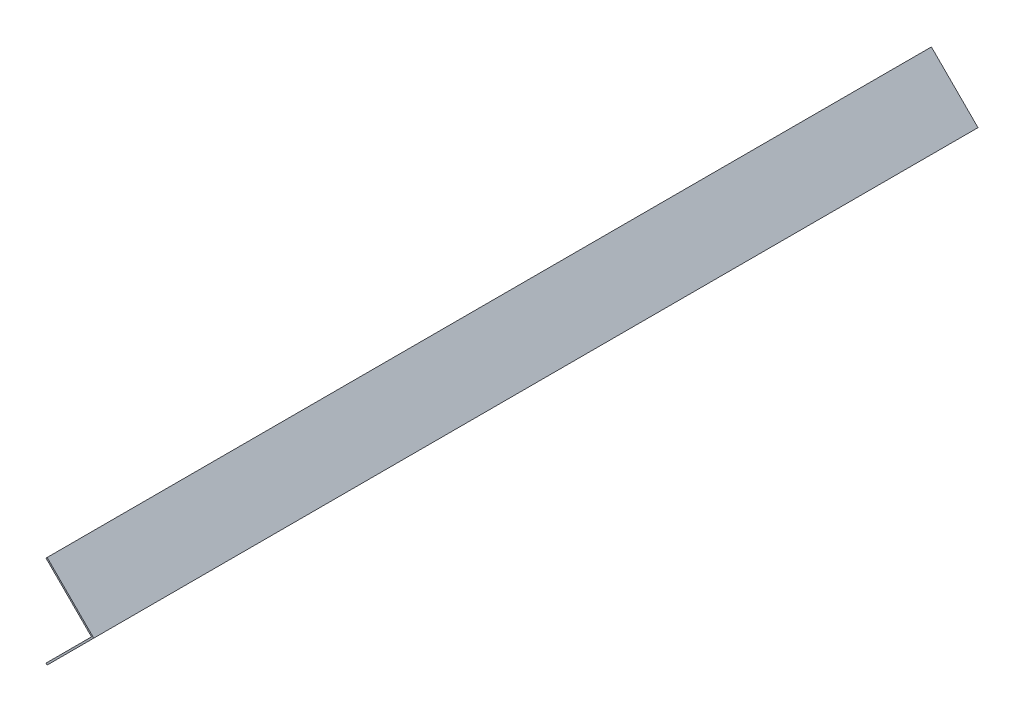
ISO-10303-21;
HEADER;
FILE_DESCRIPTION(('STEP AP214'),'2;1');
FILE_NAME('part.step','',(''),(''),'','','');
FILE_SCHEMA(('AUTOMOTIVE_DESIGN { 1 0 10303 214 1 1 1 1 }'));
ENDSEC;
DATA;
#1=APPLICATION_CONTEXT('core data for automotive mechanical design processes');
#2=APPLICATION_PROTOCOL_DEFINITION('international standard','automotive_design',2000,#1);
#3=PRODUCT_CONTEXT('',#1,'mechanical');
#4=PRODUCT('Part','Part','',(#3));
#5=PRODUCT_RELATED_PRODUCT_CATEGORY('part','',(#4));
#6=PRODUCT_DEFINITION_FORMATION('','',#4);
#7=PRODUCT_DEFINITION_CONTEXT('part definition',#1,'design');
#8=PRODUCT_DEFINITION('design','',#6,#7);
#9=PRODUCT_DEFINITION_SHAPE('','',#8);
#10=(LENGTH_UNIT() NAMED_UNIT(*) SI_UNIT(.MILLI.,.METRE.));
#11=(NAMED_UNIT(*) PLANE_ANGLE_UNIT() SI_UNIT($,.RADIAN.));
#12=(NAMED_UNIT(*) SI_UNIT($,.STERADIAN.) SOLID_ANGLE_UNIT());
#13=UNCERTAINTY_MEASURE_WITH_UNIT(LENGTH_MEASURE(1.E-05),#10,'distance_accuracy_value','');
#14=(GEOMETRIC_REPRESENTATION_CONTEXT(3) GLOBAL_UNCERTAINTY_ASSIGNED_CONTEXT((#13)) GLOBAL_UNIT_ASSIGNED_CONTEXT((#10,
#11,#12)) REPRESENTATION_CONTEXT('',''));
#15=CARTESIAN_POINT('',(0.,0.,0.));
#16=DIRECTION('',(0.,0.,1.));
#17=DIRECTION('',(1.,0.,0.));
#18=AXIS2_PLACEMENT_3D('',#15,#16,#17);
#19=CARTESIAN_POINT('',(0.,0.,275.));
#20=DIRECTION('',(0.707106781186548,-0.707106781186548,0.));
#21=DIRECTION('',(0.707106781186548,0.707106781186548,0.));
#22=AXIS2_PLACEMENT_3D('',#19,#20,#21);
#23=PLANE('',#22);
#24=DIRECTION('',(-0.707106781186548,-0.707106781186548,0.));
#25=VECTOR('',#24,1.);
#26=CARTESIAN_POINT('',(0.,0.,-275.));
#27=LINE('',#26,#25);
#28=CARTESIAN_POINT('',(0.,0.,-275.));
#29=VERTEX_POINT('',#28);
#30=CARTESIAN_POINT('',(-28.2842712474619,-28.2842712474619,-275.));
#31=VERTEX_POINT('',#30);
#32=EDGE_CURVE('E117',#29,#31,#27,.T.);
#33=ORIENTED_EDGE('',*,*,#32,.T.);
#34=DIRECTION('',(0.,0.,-1.));
#35=VECTOR('',#34,1.);
#36=CARTESIAN_POINT('',(-28.2842712474619,-28.2842712474619,275.));
#37=LINE('',#36,#35);
#38=CARTESIAN_POINT('',(-28.2842712474619,-28.2842712474619,275.));
#39=VERTEX_POINT('',#38);
#40=EDGE_CURVE('E11',#39,#31,#37,.T.);
#41=ORIENTED_EDGE('',*,*,#40,.F.);
#42=DIRECTION('',(-0.707106781186548,-0.707106781186548,0.));
#43=VECTOR('',#42,1.);
#44=CARTESIAN_POINT('',(0.,0.,275.));
#45=LINE('',#44,#43);
#46=CARTESIAN_POINT('',(0.,0.,275.));
#47=VERTEX_POINT('',#46);
#48=EDGE_CURVE('E127',#47,#39,#45,.T.);
#49=ORIENTED_EDGE('',*,*,#48,.F.);
#50=DIRECTION('',(0.,0.,-1.));
#51=VECTOR('',#50,1.);
#52=CARTESIAN_POINT('',(0.,0.,275.));
#53=LINE('',#52,#51);
#54=EDGE_CURVE('E113',#47,#29,#53,.T.);
#55=ORIENTED_EDGE('',*,*,#54,.T.);
#56=EDGE_LOOP('',(#33,#41,#49,#55));
#57=FACE_BOUND('',#56,.T.);
#58=ADVANCED_FACE('F33',(#57),#23,.F.);
#59=CARTESIAN_POINT('',(-27.5771644662754,-28.9913780286485,275.));
#60=DIRECTION('',(0.707106781186554,0.707106781186541,0.));
#61=DIRECTION('',(-0.707106781186541,0.707106781186554,0.));
#62=AXIS2_PLACEMENT_3D('',#59,#60,#61);
#63=PLANE('',#62);
#64=DIRECTION('',(0.707106781186541,-0.707106781186554,0.));
#65=VECTOR('',#64,1.);
#66=CARTESIAN_POINT('',(-27.5771644662754,-28.9913780286485,-275.));
#67=LINE('',#66,#65);
#68=CARTESIAN_POINT('',(-27.5771644662754,-28.9913780286485,-275.));
#69=VERTEX_POINT('',#68);
#70=EDGE_CURVE('E120',#31,#69,#67,.T.);
#71=ORIENTED_EDGE('',*,*,#70,.T.);
#72=DIRECTION('',(0.,0.,-1.));
#73=VECTOR('',#72,1.);
#74=CARTESIAN_POINT('',(-27.5771644662754,-28.9913780286485,275.));
#75=LINE('',#74,#73);
#76=CARTESIAN_POINT('',(-27.5771644662754,-28.9913780286485,275.));
#77=VERTEX_POINT('',#76);
#78=EDGE_CURVE('E41',#77,#69,#75,.T.);
#79=ORIENTED_EDGE('',*,*,#78,.F.);
#80=DIRECTION('',(0.707106781186541,-0.707106781186554,0.));
#81=VECTOR('',#80,1.);
#82=CARTESIAN_POINT('',(-27.5771644662754,-28.9913780286485,275.));
#83=LINE('',#82,#81);
#84=EDGE_CURVE('E86',#39,#77,#83,.T.);
#85=ORIENTED_EDGE('',*,*,#84,.F.);
#86=ORIENTED_EDGE('',*,*,#40,.T.);
#87=EDGE_LOOP('',(#71,#79,#85,#86));
#88=FACE_BOUND('',#87,.T.);
#89=ADVANCED_FACE('F151',(#88),#63,.F.);
#90=CARTESIAN_POINT('',(1.41421356237309,0.,275.));
#91=DIRECTION('',(-0.707106781186548,0.707106781186547,0.));
#92=DIRECTION('',(-0.707106781186547,-0.707106781186548,0.));
#93=AXIS2_PLACEMENT_3D('',#90,#91,#92);
#94=PLANE('',#93);
#95=DIRECTION('',(0.707106781186548,0.707106781186548,0.));
#96=VECTOR('',#95,1.);
#97=CARTESIAN_POINT('',(1.41421356237309,0.,-275.));
#98=LINE('',#97,#96);
#99=CARTESIAN_POINT('',(1.41421356237309,0.,-275.));
#100=VERTEX_POINT('',#99);
#101=EDGE_CURVE('E122',#69,#100,#98,.T.);
#102=ORIENTED_EDGE('',*,*,#101,.T.);
#103=DIRECTION('',(0.,0.,-1.));
#104=VECTOR('',#103,1.);
#105=CARTESIAN_POINT('',(1.41421356237309,0.,275.));
#106=LINE('',#105,#104);
#107=CARTESIAN_POINT('',(1.41421356237309,0.,275.));
#108=VERTEX_POINT('',#107);
#109=EDGE_CURVE('E108',#108,#100,#106,.T.);
#110=ORIENTED_EDGE('',*,*,#109,.F.);
#111=DIRECTION('',(0.707106781186548,0.707106781186548,0.));
#112=VECTOR('',#111,1.);
#113=CARTESIAN_POINT('',(1.41421356237309,0.,275.));
#114=LINE('',#113,#112);
#115=EDGE_CURVE('E99',#77,#108,#114,.T.);
#116=ORIENTED_EDGE('',*,*,#115,.F.);
#117=ORIENTED_EDGE('',*,*,#78,.T.);
#118=EDGE_LOOP('',(#102,#110,#116,#117));
#119=FACE_BOUND('',#118,.T.);
#120=ADVANCED_FACE('F133',(#119),#94,.F.);
#121=CARTESIAN_POINT('',(1.41421356237309,0.,275.));
#122=DIRECTION('',(-0.70710678118655,-0.707106781186545,0.));
#123=DIRECTION('',(0.707106781186545,-0.70710678118655,0.));
#124=AXIS2_PLACEMENT_3D('',#121,#122,#123);
#125=PLANE('',#124);
#126=DIRECTION('',(-0.707106781186545,0.70710678118655,0.));
#127=VECTOR('',#126,1.);
#128=CARTESIAN_POINT('',(1.41421356237309,0.,-275.));
#129=LINE('',#128,#127);
#130=CARTESIAN_POINT('',(-27.5771644662752,28.9913780286486,-275.));
#131=VERTEX_POINT('',#130);
#132=EDGE_CURVE('E107',#100,#131,#129,.T.);
#133=ORIENTED_EDGE('',*,*,#132,.T.);
#134=DIRECTION('',(0.,0.,-1.));
#135=VECTOR('',#134,1.);
#136=CARTESIAN_POINT('',(-27.5771644662752,28.9913780286486,275.));
#137=LINE('',#136,#135);
#138=CARTESIAN_POINT('',(-27.5771644662752,28.9913780286486,275.));
#139=VERTEX_POINT('',#138);
#140=EDGE_CURVE('E104',#139,#131,#137,.T.);
#141=ORIENTED_EDGE('',*,*,#140,.F.);
#142=DIRECTION('',(-0.707106781186545,0.70710678118655,0.));
#143=VECTOR('',#142,1.);
#144=CARTESIAN_POINT('',(1.41421356237309,0.,275.));
#145=LINE('',#144,#143);
#146=EDGE_CURVE('E93',#108,#139,#145,.T.);
#147=ORIENTED_EDGE('',*,*,#146,.F.);
#148=ORIENTED_EDGE('',*,*,#109,.T.);
#149=EDGE_LOOP('',(#133,#141,#147,#148));
#150=FACE_BOUND('',#149,.T.);
#151=ADVANCED_FACE('F105',(#150),#125,.F.);
#152=CARTESIAN_POINT('',(-28.2842712474618,28.284271247462,275.));
#153=DIRECTION('',(0.707106781186549,-0.707106781186546,0.));
#154=DIRECTION('',(0.707106781186546,0.707106781186549,0.));
#155=AXIS2_PLACEMENT_3D('',#152,#153,#154);
#156=PLANE('',#155);
#157=DIRECTION('',(-0.707106781186546,-0.707106781186549,0.));
#158=VECTOR('',#157,1.);
#159=CARTESIAN_POINT('',(-28.2842712474618,28.284271247462,-275.));
#160=LINE('',#159,#158);
#161=CARTESIAN_POINT('',(-28.2842712474618,28.284271247462,-275.));
#162=VERTEX_POINT('',#161);
#163=EDGE_CURVE('E72',#131,#162,#160,.T.);
#164=ORIENTED_EDGE('',*,*,#163,.T.);
#165=DIRECTION('',(0.,0.,-1.));
#166=VECTOR('',#165,1.);
#167=CARTESIAN_POINT('',(-28.2842712474618,28.284271247462,275.));
#168=LINE('',#167,#166);
#169=CARTESIAN_POINT('',(-28.2842712474618,28.284271247462,275.));
#170=VERTEX_POINT('',#169);
#171=EDGE_CURVE('E109',#170,#162,#168,.T.);
#172=ORIENTED_EDGE('',*,*,#171,.F.);
#173=DIRECTION('',(-0.707106781186546,-0.707106781186549,0.));
#174=VECTOR('',#173,1.);
#175=CARTESIAN_POINT('',(-28.2842712474618,28.284271247462,275.));
#176=LINE('',#175,#174);
#177=EDGE_CURVE('E97',#139,#170,#176,.T.);
#178=ORIENTED_EDGE('',*,*,#177,.F.);
#179=ORIENTED_EDGE('',*,*,#140,.T.);
#180=EDGE_LOOP('',(#164,#172,#178,#179));
#181=FACE_BOUND('',#180,.T.);
#182=ADVANCED_FACE('F111',(#181),#156,.F.);
#183=CARTESIAN_POINT('',(0.,0.,275.));
#184=DIRECTION('',(0.70710678118655,0.707106781186545,0.));
#185=DIRECTION('',(-0.707106781186545,0.70710678118655,0.));
#186=AXIS2_PLACEMENT_3D('',#183,#184,#185);
#187=PLANE('',#186);
#188=DIRECTION('',(0.707106781186545,-0.70710678118655,0.));
#189=VECTOR('',#188,1.);
#190=CARTESIAN_POINT('',(0.,0.,-275.));
#191=LINE('',#190,#189);
#192=EDGE_CURVE('E78',#162,#29,#191,.T.);
#193=ORIENTED_EDGE('',*,*,#192,.T.);
#194=ORIENTED_EDGE('',*,*,#54,.F.);
#195=DIRECTION('',(0.707106781186545,-0.70710678118655,0.));
#196=VECTOR('',#195,1.);
#197=CARTESIAN_POINT('',(0.,0.,275.));
#198=LINE('',#197,#196);
#199=EDGE_CURVE('E49',#170,#47,#198,.T.);
#200=ORIENTED_EDGE('',*,*,#199,.F.);
#201=ORIENTED_EDGE('',*,*,#171,.T.);
#202=EDGE_LOOP('',(#193,#194,#200,#201));
#203=FACE_BOUND('',#202,.T.);
#204=ADVANCED_FACE('F140',(#203),#187,.F.);
#205=CARTESIAN_POINT('',(0.,0.,275.));
#206=DIRECTION('',(0.,0.,-1.));
#207=DIRECTION('',(-1.,0.,0.));
#208=AXIS2_PLACEMENT_3D('',#205,#206,#207);
#209=PLANE('',#208);
#210=ORIENTED_EDGE('',*,*,#48,.T.);
#211=ORIENTED_EDGE('',*,*,#84,.T.);
#212=ORIENTED_EDGE('',*,*,#115,.T.);
#213=ORIENTED_EDGE('',*,*,#146,.T.);
#214=ORIENTED_EDGE('',*,*,#177,.T.);
#215=ORIENTED_EDGE('',*,*,#199,.T.);
#216=EDGE_LOOP('',(#210,#211,#212,#213,#214,#215));
#217=FACE_BOUND('',#216,.T.);
#218=ADVANCED_FACE('F95',(#217),#209,.F.);
#219=CARTESIAN_POINT('',(0.,0.,-275.));
#220=DIRECTION('',(0.,0.,-1.));
#221=DIRECTION('',(-1.,0.,0.));
#222=AXIS2_PLACEMENT_3D('',#219,#220,#221);
#223=PLANE('',#222);
#224=ORIENTED_EDGE('',*,*,#32,.F.);
#225=ORIENTED_EDGE('',*,*,#192,.F.);
#226=ORIENTED_EDGE('',*,*,#163,.F.);
#227=ORIENTED_EDGE('',*,*,#132,.F.);
#228=ORIENTED_EDGE('',*,*,#101,.F.);
#229=ORIENTED_EDGE('',*,*,#70,.F.);
#230=EDGE_LOOP('',(#224,#225,#226,#227,#228,#229));
#231=FACE_BOUND('',#230,.T.);
#232=ADVANCED_FACE('F136',(#231),#223,.T.);
#233=CLOSED_SHELL('',(#58,#89,#120,#151,#182,#204,#218,#232));
#234=MANIFOLD_SOLID_BREP('B2',#233);
#235=ADVANCED_BREP_SHAPE_REPRESENTATION('',(#18,#234),#14);
#236=SHAPE_DEFINITION_REPRESENTATION(#9,#235);
ENDSEC;
END-ISO-10303-21;
